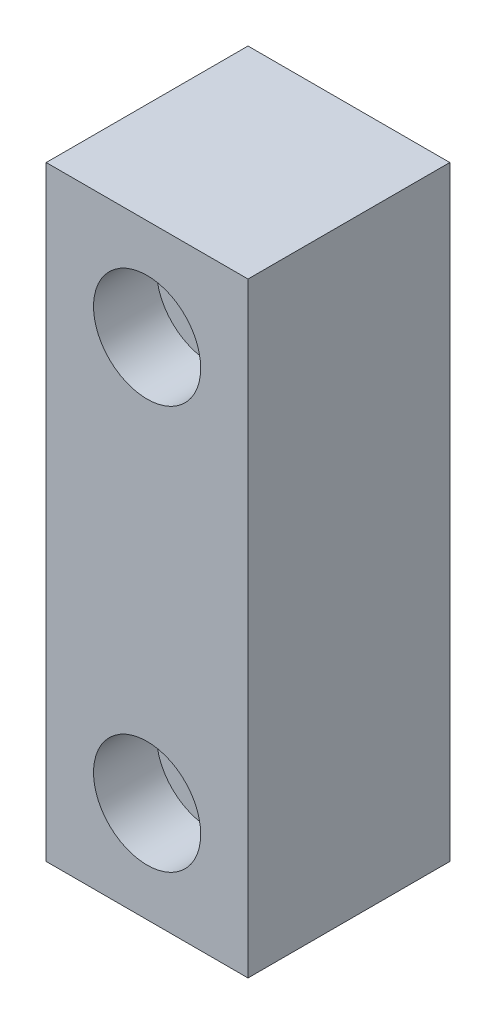
ISO-10303-21;
HEADER;
FILE_DESCRIPTION(('STEP AP214'),'2;1');
FILE_NAME('part.step','',(''),(''),'','','');
FILE_SCHEMA(('AUTOMOTIVE_DESIGN { 1 0 10303 214 1 1 1 1 }'));
ENDSEC;
DATA;
#1=APPLICATION_CONTEXT('core data for automotive mechanical design processes');
#2=APPLICATION_PROTOCOL_DEFINITION('international standard','automotive_design',2000,#1);
#3=PRODUCT_CONTEXT('',#1,'mechanical');
#4=PRODUCT('Part','Part','',(#3));
#5=PRODUCT_RELATED_PRODUCT_CATEGORY('part','',(#4));
#6=PRODUCT_DEFINITION_FORMATION('','',#4);
#7=PRODUCT_DEFINITION_CONTEXT('part definition',#1,'design');
#8=PRODUCT_DEFINITION('design','',#6,#7);
#9=PRODUCT_DEFINITION_SHAPE('','',#8);
#10=(LENGTH_UNIT() NAMED_UNIT(*) SI_UNIT(.MILLI.,.METRE.));
#11=(NAMED_UNIT(*) PLANE_ANGLE_UNIT() SI_UNIT($,.RADIAN.));
#12=(NAMED_UNIT(*) SI_UNIT($,.STERADIAN.) SOLID_ANGLE_UNIT());
#13=UNCERTAINTY_MEASURE_WITH_UNIT(LENGTH_MEASURE(1.E-05),#10,'distance_accuracy_value','');
#14=(GEOMETRIC_REPRESENTATION_CONTEXT(3) GLOBAL_UNCERTAINTY_ASSIGNED_CONTEXT((#13)) GLOBAL_UNIT_ASSIGNED_CONTEXT((#10,
#11,#12)) REPRESENTATION_CONTEXT('',''));
#15=CARTESIAN_POINT('',(0.,0.,0.));
#16=DIRECTION('',(0.,0.,1.));
#17=DIRECTION('',(1.,0.,0.));
#18=AXIS2_PLACEMENT_3D('',#15,#16,#17);
#19=CARTESIAN_POINT('',(12.7,38.1,12.7));
#20=DIRECTION('',(0.,-1.,0.));
#21=DIRECTION('',(0.,0.,-1.));
#22=AXIS2_PLACEMENT_3D('',#19,#20,#21);
#23=PLANE('',#22);
#24=DIRECTION('',(-1.,0.,0.));
#25=VECTOR('',#24,1.);
#26=CARTESIAN_POINT('',(12.7,38.1,-12.7));
#27=LINE('',#26,#25);
#28=CARTESIAN_POINT('',(12.7,38.1,-12.7));
#29=VERTEX_POINT('',#28);
#30=CARTESIAN_POINT('',(-12.7,38.1,-12.7));
#31=VERTEX_POINT('',#30);
#32=EDGE_CURVE('E106',#29,#31,#27,.T.);
#33=ORIENTED_EDGE('',*,*,#32,.T.);
#34=DIRECTION('',(0.,0.,-1.));
#35=VECTOR('',#34,1.);
#36=CARTESIAN_POINT('',(-12.7,38.1,12.7));
#37=LINE('',#36,#35);
#38=CARTESIAN_POINT('',(-12.7,38.1,12.7));
#39=VERTEX_POINT('',#38);
#40=EDGE_CURVE('E11',#39,#31,#37,.T.);
#41=ORIENTED_EDGE('',*,*,#40,.F.);
#42=DIRECTION('',(-1.,0.,0.));
#43=VECTOR('',#42,1.);
#44=CARTESIAN_POINT('',(12.7,38.1,12.7));
#45=LINE('',#44,#43);
#46=CARTESIAN_POINT('',(12.7,38.1,12.7));
#47=VERTEX_POINT('',#46);
#48=EDGE_CURVE('E94',#47,#39,#45,.T.);
#49=ORIENTED_EDGE('',*,*,#48,.F.);
#50=DIRECTION('',(0.,0.,-1.));
#51=VECTOR('',#50,1.);
#52=CARTESIAN_POINT('',(12.7,38.1,12.7));
#53=LINE('',#52,#51);
#54=EDGE_CURVE('E102',#47,#29,#53,.T.);
#55=ORIENTED_EDGE('',*,*,#54,.T.);
#56=EDGE_LOOP('',(#33,#41,#49,#55));
#57=FACE_BOUND('',#56,.T.);
#58=ADVANCED_FACE('F43',(#57),#23,.F.);
#59=CARTESIAN_POINT('',(-12.7,-38.1,12.7));
#60=DIRECTION('',(1.,0.,0.));
#61=DIRECTION('',(0.,0.,-1.));
#62=AXIS2_PLACEMENT_3D('',#59,#60,#61);
#63=PLANE('',#62);
#64=DIRECTION('',(0.,-1.,0.));
#65=VECTOR('',#64,1.);
#66=CARTESIAN_POINT('',(-12.7,-38.1,-12.7));
#67=LINE('',#66,#65);
#68=CARTESIAN_POINT('',(-12.7,-38.1,-12.7));
#69=VERTEX_POINT('',#68);
#70=EDGE_CURVE('E98',#31,#69,#67,.T.);
#71=ORIENTED_EDGE('',*,*,#70,.T.);
#72=DIRECTION('',(0.,0.,-1.));
#73=VECTOR('',#72,1.);
#74=CARTESIAN_POINT('',(-12.7,-38.1,12.7));
#75=LINE('',#74,#73);
#76=CARTESIAN_POINT('',(-12.7,-38.1,12.7));
#77=VERTEX_POINT('',#76);
#78=EDGE_CURVE('E51',#77,#69,#75,.T.);
#79=ORIENTED_EDGE('',*,*,#78,.F.);
#80=DIRECTION('',(0.,-1.,0.));
#81=VECTOR('',#80,1.);
#82=CARTESIAN_POINT('',(-12.7,-38.1,12.7));
#83=LINE('',#82,#81);
#84=EDGE_CURVE('E89',#39,#77,#83,.T.);
#85=ORIENTED_EDGE('',*,*,#84,.F.);
#86=ORIENTED_EDGE('',*,*,#40,.T.);
#87=EDGE_LOOP('',(#71,#79,#85,#86));
#88=FACE_BOUND('',#87,.T.);
#89=ADVANCED_FACE('F97',(#88),#63,.F.);
#90=CARTESIAN_POINT('',(12.7,-38.1,12.7));
#91=DIRECTION('',(0.,1.,0.));
#92=DIRECTION('',(0.,0.,1.));
#93=AXIS2_PLACEMENT_3D('',#90,#91,#92);
#94=PLANE('',#93);
#95=DIRECTION('',(1.,0.,0.));
#96=VECTOR('',#95,1.);
#97=CARTESIAN_POINT('',(12.7,-38.1,-12.7));
#98=LINE('',#97,#96);
#99=CARTESIAN_POINT('',(12.7,-38.1,-12.7));
#100=VERTEX_POINT('',#99);
#101=EDGE_CURVE('E76',#69,#100,#98,.T.);
#102=ORIENTED_EDGE('',*,*,#101,.T.);
#103=DIRECTION('',(0.,0.,-1.));
#104=VECTOR('',#103,1.);
#105=CARTESIAN_POINT('',(12.7,-38.1,12.7));
#106=LINE('',#105,#104);
#107=CARTESIAN_POINT('',(12.7,-38.1,12.7));
#108=VERTEX_POINT('',#107);
#109=EDGE_CURVE('E99',#108,#100,#106,.T.);
#110=ORIENTED_EDGE('',*,*,#109,.F.);
#111=DIRECTION('',(1.,0.,0.));
#112=VECTOR('',#111,1.);
#113=CARTESIAN_POINT('',(12.7,-38.1,12.7));
#114=LINE('',#113,#112);
#115=EDGE_CURVE('E92',#77,#108,#114,.T.);
#116=ORIENTED_EDGE('',*,*,#115,.F.);
#117=ORIENTED_EDGE('',*,*,#78,.T.);
#118=EDGE_LOOP('',(#102,#110,#116,#117));
#119=FACE_BOUND('',#118,.T.);
#120=ADVANCED_FACE('F100',(#119),#94,.F.);
#121=CARTESIAN_POINT('',(12.7,-38.1,12.7));
#122=DIRECTION('',(-1.,0.,0.));
#123=DIRECTION('',(0.,0.,1.));
#124=AXIS2_PLACEMENT_3D('',#121,#122,#123);
#125=PLANE('',#124);
#126=DIRECTION('',(0.,1.,0.));
#127=VECTOR('',#126,1.);
#128=CARTESIAN_POINT('',(12.7,-38.1,-12.7));
#129=LINE('',#128,#127);
#130=EDGE_CURVE('E82',#100,#29,#129,.T.);
#131=ORIENTED_EDGE('',*,*,#130,.T.);
#132=ORIENTED_EDGE('',*,*,#54,.F.);
#133=DIRECTION('',(0.,1.,0.));
#134=VECTOR('',#133,1.);
#135=CARTESIAN_POINT('',(12.7,-38.1,12.7));
#136=LINE('',#135,#134);
#137=EDGE_CURVE('E59',#108,#47,#136,.T.);
#138=ORIENTED_EDGE('',*,*,#137,.F.);
#139=ORIENTED_EDGE('',*,*,#109,.T.);
#140=EDGE_LOOP('',(#131,#132,#138,#139));
#141=FACE_BOUND('',#140,.T.);
#142=ADVANCED_FACE('F114',(#141),#125,.F.);
#143=CARTESIAN_POINT('',(0.,0.,12.7));
#144=DIRECTION('',(0.,0.,-1.));
#145=DIRECTION('',(-1.,0.,0.));
#146=AXIS2_PLACEMENT_3D('',#143,#144,#145);
#147=PLANE('',#146);
#148=CARTESIAN_POINT('',(0.,25.4,12.7));
#149=DIRECTION('',(0.,0.,1.));
#150=DIRECTION('',(1.,0.,0.));
#151=AXIS2_PLACEMENT_3D('',#148,#149,#150);
#152=CIRCLE('',#151,6.7437);
#153=CARTESIAN_POINT('',(6.7437,25.4,12.7));
#154=VERTEX_POINT('',#153);
#155=EDGE_CURVE('E140',#154,#154,#152,.T.);
#156=ORIENTED_EDGE('',*,*,#155,.F.);
#157=EDGE_LOOP('',(#156));
#158=FACE_BOUND('',#157,.T.);
#159=CARTESIAN_POINT('',(0.,-25.4,12.7));
#160=DIRECTION('',(0.,0.,1.));
#161=DIRECTION('',(1.,0.,0.));
#162=AXIS2_PLACEMENT_3D('',#159,#160,#161);
#163=CIRCLE('',#162,6.7437);
#164=CARTESIAN_POINT('',(6.7437,-25.4,12.7));
#165=VERTEX_POINT('',#164);
#166=EDGE_CURVE('E128',#165,#165,#163,.T.);
#167=ORIENTED_EDGE('',*,*,#166,.F.);
#168=EDGE_LOOP('',(#167));
#169=FACE_BOUND('',#168,.T.);
#170=ORIENTED_EDGE('',*,*,#48,.T.);
#171=ORIENTED_EDGE('',*,*,#84,.T.);
#172=ORIENTED_EDGE('',*,*,#115,.T.);
#173=ORIENTED_EDGE('',*,*,#137,.T.);
#174=EDGE_LOOP('',(#170,#171,#172,#173));
#175=FACE_BOUND('',#174,.T.);
#176=ADVANCED_FACE('F90',(#158,#169,#175),#147,.F.);
#177=CARTESIAN_POINT('',(0.,0.,-12.7));
#178=DIRECTION('',(0.,0.,-1.));
#179=DIRECTION('',(-1.,0.,0.));
#180=AXIS2_PLACEMENT_3D('',#177,#178,#179);
#181=PLANE('',#180);
#182=CARTESIAN_POINT('',(0.,25.4,-12.7));
#183=DIRECTION('',(0.,0.,1.));
#184=DIRECTION('',(1.,0.,0.));
#185=AXIS2_PLACEMENT_3D('',#182,#183,#184);
#186=CIRCLE('',#185,4.36879999999999);
#187=CARTESIAN_POINT('',(4.36879999999999,25.4,-12.7));
#188=VERTEX_POINT('',#187);
#189=EDGE_CURVE('E131',#188,#188,#186,.T.);
#190=ORIENTED_EDGE('',*,*,#189,.T.);
#191=EDGE_LOOP('',(#190));
#192=FACE_BOUND('',#191,.T.);
#193=CARTESIAN_POINT('',(0.,-25.4,-12.7));
#194=DIRECTION('',(0.,0.,1.));
#195=DIRECTION('',(1.,0.,0.));
#196=AXIS2_PLACEMENT_3D('',#193,#194,#195);
#197=CIRCLE('',#196,4.36879999999999);
#198=CARTESIAN_POINT('',(4.36879999999999,-25.4,-12.7));
#199=VERTEX_POINT('',#198);
#200=EDGE_CURVE('E109',#199,#199,#197,.T.);
#201=ORIENTED_EDGE('',*,*,#200,.T.);
#202=EDGE_LOOP('',(#201));
#203=FACE_BOUND('',#202,.T.);
#204=ORIENTED_EDGE('',*,*,#32,.F.);
#205=ORIENTED_EDGE('',*,*,#130,.F.);
#206=ORIENTED_EDGE('',*,*,#101,.F.);
#207=ORIENTED_EDGE('',*,*,#70,.F.);
#208=EDGE_LOOP('',(#204,#205,#206,#207));
#209=FACE_BOUND('',#208,.T.);
#210=ADVANCED_FACE('F117',(#192,#203,#209),#181,.T.);
#211=CARTESIAN_POINT('',(0.,-25.4,12.7));
#212=DIRECTION('',(0.,0.,1.));
#213=DIRECTION('',(1.,0.,0.));
#214=AXIS2_PLACEMENT_3D('',#211,#212,#213);
#215=CYLINDRICAL_SURFACE('',#214,4.36879999999999);
#216=ORIENTED_EDGE('',*,*,#200,.F.);
#217=EDGE_LOOP('',(#216));
#218=FACE_BOUND('',#217,.T.);
#219=CARTESIAN_POINT('',(0.,-25.4,4.77520000000001));
#220=DIRECTION('',(0.,0.,1.));
#221=DIRECTION('',(1.,0.,0.));
#222=AXIS2_PLACEMENT_3D('',#219,#220,#221);
#223=CIRCLE('',#222,4.36879999999999);
#224=CARTESIAN_POINT('',(4.36879999999999,-25.4,4.77520000000001));
#225=VERTEX_POINT('',#224);
#226=EDGE_CURVE('E122',#225,#225,#223,.T.);
#227=ORIENTED_EDGE('',*,*,#226,.T.);
#228=EDGE_LOOP('',(#227));
#229=FACE_BOUND('',#228,.T.);
#230=ADVANCED_FACE('F164',(#218,#229),#215,.F.);
#231=CARTESIAN_POINT('',(4.36879999999999,-25.4,4.7752));
#232=DIRECTION('',(0.,0.,-1.));
#233=DIRECTION('',(-1.,0.,0.));
#234=AXIS2_PLACEMENT_3D('',#231,#232,#233);
#235=PLANE('',#234);
#236=ORIENTED_EDGE('',*,*,#226,.F.);
#237=EDGE_LOOP('',(#236));
#238=FACE_BOUND('',#237,.T.);
#239=CARTESIAN_POINT('',(0.,-25.4,4.7752));
#240=DIRECTION('',(0.,0.,1.));
#241=DIRECTION('',(1.,0.,0.));
#242=AXIS2_PLACEMENT_3D('',#239,#240,#241);
#243=CIRCLE('',#242,6.7437);
#244=CARTESIAN_POINT('',(6.7437,-25.4,4.7752));
#245=VERTEX_POINT('',#244);
#246=EDGE_CURVE('E125',#245,#245,#243,.T.);
#247=ORIENTED_EDGE('',*,*,#246,.T.);
#248=EDGE_LOOP('',(#247));
#249=FACE_BOUND('',#248,.T.);
#250=ADVANCED_FACE('F154',(#238,#249),#235,.F.);
#251=CARTESIAN_POINT('',(0.,-25.4,12.7));
#252=DIRECTION('',(0.,0.,1.));
#253=DIRECTION('',(1.,0.,0.));
#254=AXIS2_PLACEMENT_3D('',#251,#252,#253);
#255=CYLINDRICAL_SURFACE('',#254,6.7437);
#256=ORIENTED_EDGE('',*,*,#246,.F.);
#257=EDGE_LOOP('',(#256));
#258=FACE_BOUND('',#257,.T.);
#259=ORIENTED_EDGE('',*,*,#166,.T.);
#260=EDGE_LOOP('',(#259));
#261=FACE_BOUND('',#260,.T.);
#262=ADVANCED_FACE('F151',(#258,#261),#255,.F.);
#263=CARTESIAN_POINT('',(0.,25.4,12.7));
#264=DIRECTION('',(0.,0.,1.));
#265=DIRECTION('',(1.,0.,0.));
#266=AXIS2_PLACEMENT_3D('',#263,#264,#265);
#267=CYLINDRICAL_SURFACE('',#266,4.36879999999999);
#268=ORIENTED_EDGE('',*,*,#189,.F.);
#269=EDGE_LOOP('',(#268));
#270=FACE_BOUND('',#269,.T.);
#271=CARTESIAN_POINT('',(0.,25.4,4.77520000000001));
#272=DIRECTION('',(0.,0.,1.));
#273=DIRECTION('',(1.,0.,0.));
#274=AXIS2_PLACEMENT_3D('',#271,#272,#273);
#275=CIRCLE('',#274,4.36879999999999);
#276=CARTESIAN_POINT('',(4.36879999999999,25.4,4.77520000000001));
#277=VERTEX_POINT('',#276);
#278=EDGE_CURVE('E134',#277,#277,#275,.T.);
#279=ORIENTED_EDGE('',*,*,#278,.T.);
#280=EDGE_LOOP('',(#279));
#281=FACE_BOUND('',#280,.T.);
#282=ADVANCED_FACE('F153',(#270,#281),#267,.F.);
#283=CARTESIAN_POINT('',(4.36879999999999,25.4,4.7752));
#284=DIRECTION('',(0.,0.,-1.));
#285=DIRECTION('',(-1.,0.,0.));
#286=AXIS2_PLACEMENT_3D('',#283,#284,#285);
#287=PLANE('',#286);
#288=ORIENTED_EDGE('',*,*,#278,.F.);
#289=EDGE_LOOP('',(#288));
#290=FACE_BOUND('',#289,.T.);
#291=CARTESIAN_POINT('',(0.,25.4,4.7752));
#292=DIRECTION('',(0.,0.,1.));
#293=DIRECTION('',(1.,0.,0.));
#294=AXIS2_PLACEMENT_3D('',#291,#292,#293);
#295=CIRCLE('',#294,6.7437);
#296=CARTESIAN_POINT('',(6.7437,25.4,4.7752));
#297=VERTEX_POINT('',#296);
#298=EDGE_CURVE('E137',#297,#297,#295,.T.);
#299=ORIENTED_EDGE('',*,*,#298,.T.);
#300=EDGE_LOOP('',(#299));
#301=FACE_BOUND('',#300,.T.);
#302=ADVANCED_FACE('F161',(#290,#301),#287,.F.);
#303=CARTESIAN_POINT('',(0.,25.4,12.7));
#304=DIRECTION('',(0.,0.,1.));
#305=DIRECTION('',(1.,0.,0.));
#306=AXIS2_PLACEMENT_3D('',#303,#304,#305);
#307=CYLINDRICAL_SURFACE('',#306,6.7437);
#308=ORIENTED_EDGE('',*,*,#298,.F.);
#309=EDGE_LOOP('',(#308));
#310=FACE_BOUND('',#309,.T.);
#311=ORIENTED_EDGE('',*,*,#155,.T.);
#312=EDGE_LOOP('',(#311));
#313=FACE_BOUND('',#312,.T.);
#314=ADVANCED_FACE('F144',(#310,#313),#307,.F.);
#315=CLOSED_SHELL('',(#58,#89,#120,#142,#176,#210,#230,#250,#262,#282,#302,#314));
#316=MANIFOLD_SOLID_BREP('B2',#315);
#317=ADVANCED_BREP_SHAPE_REPRESENTATION('',(#18,#316),#14);
#318=SHAPE_DEFINITION_REPRESENTATION(#9,#317);
ENDSEC;
END-ISO-10303-21;
